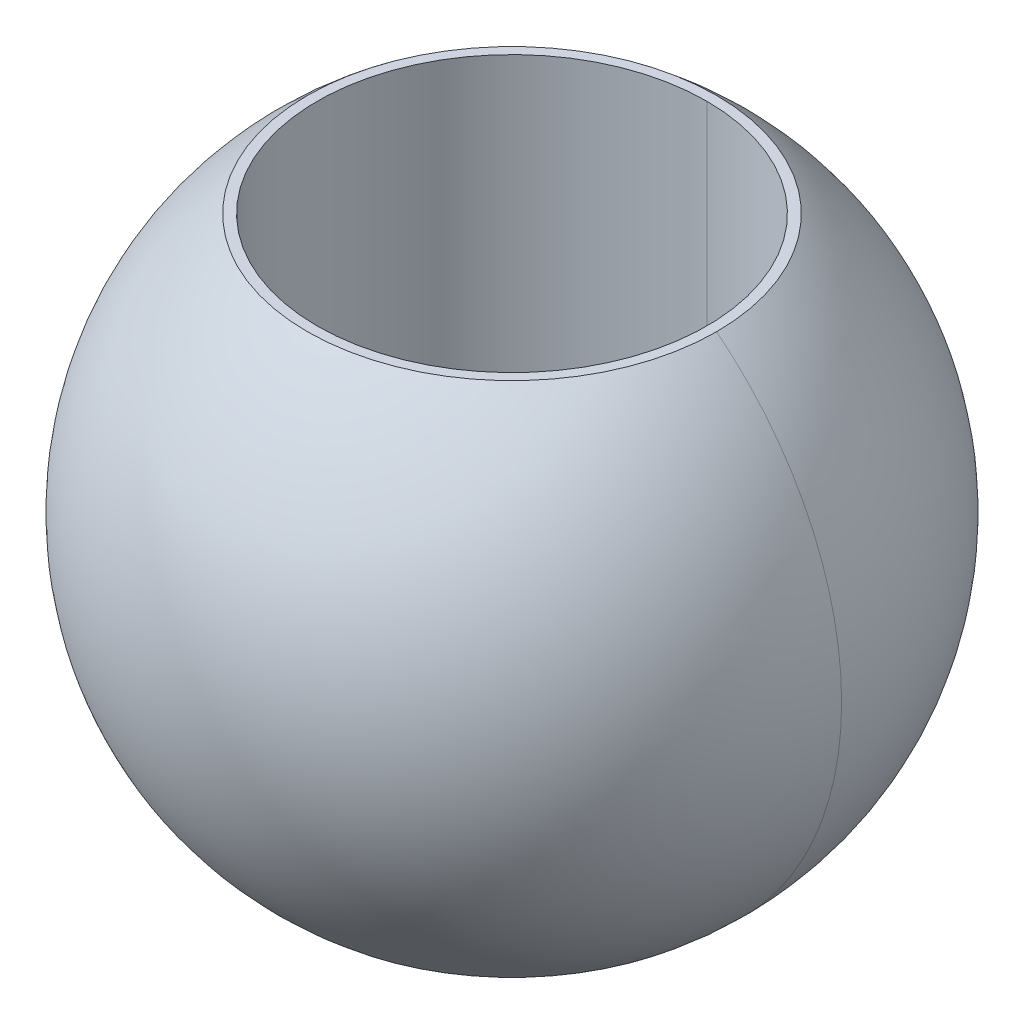
ISO-10303-21;
HEADER;
FILE_DESCRIPTION(('STEP AP214'),'2;1');
FILE_NAME('part.step','',(''),(''),'','','');
FILE_SCHEMA(('AUTOMOTIVE_DESIGN { 1 0 10303 214 1 1 1 1 }'));
ENDSEC;
DATA;
#1=APPLICATION_CONTEXT('core data for automotive mechanical design processes');
#2=APPLICATION_PROTOCOL_DEFINITION('international standard','automotive_design',2000,#1);
#3=PRODUCT_CONTEXT('',#1,'mechanical');
#4=PRODUCT('Part','Part','',(#3));
#5=PRODUCT_RELATED_PRODUCT_CATEGORY('part','',(#4));
#6=PRODUCT_DEFINITION_FORMATION('','',#4);
#7=PRODUCT_DEFINITION_CONTEXT('part definition',#1,'design');
#8=PRODUCT_DEFINITION('design','',#6,#7);
#9=PRODUCT_DEFINITION_SHAPE('','',#8);
#10=(LENGTH_UNIT() NAMED_UNIT(*) SI_UNIT(.MILLI.,.METRE.));
#11=(NAMED_UNIT(*) PLANE_ANGLE_UNIT() SI_UNIT($,.RADIAN.));
#12=(NAMED_UNIT(*) SI_UNIT($,.STERADIAN.) SOLID_ANGLE_UNIT());
#13=UNCERTAINTY_MEASURE_WITH_UNIT(LENGTH_MEASURE(1.E-05),#10,'distance_accuracy_value','');
#14=(GEOMETRIC_REPRESENTATION_CONTEXT(3) GLOBAL_UNCERTAINTY_ASSIGNED_CONTEXT((#13)) GLOBAL_UNIT_ASSIGNED_CONTEXT((#10,
#11,#12)) REPRESENTATION_CONTEXT('',''));
#15=CARTESIAN_POINT('',(0.,0.,0.));
#16=DIRECTION('',(0.,0.,1.));
#17=DIRECTION('',(1.,0.,0.));
#18=AXIS2_PLACEMENT_3D('',#15,#16,#17);
#19=CARTESIAN_POINT('',(0.,0.,0.));
#20=DIRECTION('',(0.,0.,-1.));
#21=DIRECTION('',(1.,0.,0.));
#22=AXIS2_PLACEMENT_3D('',#19,#20,#21);
#23=SPHERICAL_SURFACE('',#22,11.);
#24=CARTESIAN_POINT('',(0.,-8.62411967464942,0.));
#25=DIRECTION('',(0.,1.,0.));
#26=DIRECTION('',(0.,0.,1.));
#27=AXIS2_PLACEMENT_3D('',#24,#25,#26);
#28=CIRCLE('',#27,6.82821791079669);
#29=CARTESIAN_POINT('',(6.82821791079669,-8.62411967464942,0.));
#30=VERTEX_POINT('',#29);
#31=CARTESIAN_POINT('',(-6.82821791079669,-8.62411967464942,0.));
#32=VERTEX_POINT('',#31);
#33=EDGE_CURVE('E11',#30,#32,#28,.T.);
#34=ORIENTED_EDGE('',*,*,#33,.T.);
#35=CARTESIAN_POINT('',(0.,0.,0.));
#36=DIRECTION('',(0.,0.,-1.));
#37=DIRECTION('',(-1.,0.,0.));
#38=AXIS2_PLACEMENT_3D('',#35,#36,#37);
#39=CIRCLE('',#38,11.);
#40=CARTESIAN_POINT('',(-6.82821791079669,8.62411967464942,0.));
#41=VERTEX_POINT('',#40);
#42=EDGE_CURVE('E27',#32,#41,#39,.T.);
#43=ORIENTED_EDGE('',*,*,#42,.T.);
#44=CARTESIAN_POINT('',(0.,8.62411967464942,0.));
#45=DIRECTION('',(0.,-1.,0.));
#46=DIRECTION('',(0.,0.,-1.));
#47=AXIS2_PLACEMENT_3D('',#44,#45,#46);
#48=CIRCLE('',#47,6.82821791079669);
#49=CARTESIAN_POINT('',(6.82821791079669,8.62411967464942,0.));
#50=VERTEX_POINT('',#49);
#51=EDGE_CURVE('E87',#41,#50,#48,.T.);
#52=ORIENTED_EDGE('',*,*,#51,.T.);
#53=CARTESIAN_POINT('',(0.,0.,0.));
#54=DIRECTION('',(0.,0.,1.));
#55=DIRECTION('',(1.,0.,0.));
#56=AXIS2_PLACEMENT_3D('',#53,#54,#55);
#57=CIRCLE('',#56,11.);
#58=EDGE_CURVE('E102',#30,#50,#57,.T.);
#59=ORIENTED_EDGE('',*,*,#58,.F.);
#60=EDGE_LOOP('',(#34,#43,#52,#59));
#61=FACE_BOUND('',#60,.T.);
#62=ADVANCED_FACE('F16',(#61),#23,.T.);
#63=CARTESIAN_POINT('',(0.,-11.,0.));
#64=DIRECTION('',(0.,1.,0.));
#65=DIRECTION('',(0.,0.,1.));
#66=AXIS2_PLACEMENT_3D('',#63,#64,#65);
#67=CYLINDRICAL_SURFACE('',#66,6.5);
#68=CARTESIAN_POINT('',(0.,-8.62411967464942,0.));
#69=DIRECTION('',(0.,-1.,0.));
#70=DIRECTION('',(0.,0.,1.));
#71=AXIS2_PLACEMENT_3D('',#68,#69,#70);
#72=CIRCLE('',#71,6.5);
#73=CARTESIAN_POINT('',(0.,-8.62411967464942,6.5));
#74=VERTEX_POINT('',#73);
#75=CARTESIAN_POINT('',(0.,-8.62411967464942,-6.5));
#76=VERTEX_POINT('',#75);
#77=EDGE_CURVE('E80',#74,#76,#72,.T.);
#78=ORIENTED_EDGE('',*,*,#77,.T.);
#79=DIRECTION('',(0.,1.,0.));
#80=VECTOR('',#79,1.);
#81=CARTESIAN_POINT('',(0.,-11.,-6.5));
#82=LINE('',#81,#80);
#83=CARTESIAN_POINT('',(0.,8.62411967464942,-6.5));
#84=VERTEX_POINT('',#83);
#85=EDGE_CURVE('E71',#76,#84,#82,.T.);
#86=ORIENTED_EDGE('',*,*,#85,.T.);
#87=CARTESIAN_POINT('',(0.,8.62411967464942,0.));
#88=DIRECTION('',(0.,1.,0.));
#89=DIRECTION('',(0.,0.,-1.));
#90=AXIS2_PLACEMENT_3D('',#87,#88,#89);
#91=CIRCLE('',#90,6.5);
#92=CARTESIAN_POINT('',(0.,8.62411967464942,6.5));
#93=VERTEX_POINT('',#92);
#94=EDGE_CURVE('E81',#84,#93,#91,.T.);
#95=ORIENTED_EDGE('',*,*,#94,.T.);
#96=DIRECTION('',(0.,1.,0.));
#97=VECTOR('',#96,1.);
#98=CARTESIAN_POINT('',(0.,-11.,6.5));
#99=LINE('',#98,#97);
#100=EDGE_CURVE('E84',#74,#93,#99,.T.);
#101=ORIENTED_EDGE('',*,*,#100,.F.);
#102=EDGE_LOOP('',(#78,#86,#95,#101));
#103=FACE_BOUND('',#102,.T.);
#104=ADVANCED_FACE('F18',(#103),#67,.F.);
#105=CARTESIAN_POINT('',(0.,-11.,0.));
#106=DIRECTION('',(0.,1.,0.));
#107=DIRECTION('',(0.,0.,1.));
#108=AXIS2_PLACEMENT_3D('',#105,#106,#107);
#109=CYLINDRICAL_SURFACE('',#108,6.5);
#110=ORIENTED_EDGE('',*,*,#85,.F.);
#111=CARTESIAN_POINT('',(0.,-8.62411967464942,0.));
#112=DIRECTION('',(0.,-1.,0.));
#113=DIRECTION('',(0.,0.,1.));
#114=AXIS2_PLACEMENT_3D('',#111,#112,#113);
#115=CIRCLE('',#114,6.5);
#116=EDGE_CURVE('E75',#76,#74,#115,.T.);
#117=ORIENTED_EDGE('',*,*,#116,.T.);
#118=ORIENTED_EDGE('',*,*,#100,.T.);
#119=CARTESIAN_POINT('',(0.,8.62411967464942,0.));
#120=DIRECTION('',(0.,1.,0.));
#121=DIRECTION('',(0.,0.,-1.));
#122=AXIS2_PLACEMENT_3D('',#119,#120,#121);
#123=CIRCLE('',#122,6.5);
#124=EDGE_CURVE('E20',#93,#84,#123,.T.);
#125=ORIENTED_EDGE('',*,*,#124,.T.);
#126=EDGE_LOOP('',(#110,#117,#118,#125));
#127=FACE_BOUND('',#126,.T.);
#128=ADVANCED_FACE('F73',(#127),#109,.F.);
#129=CARTESIAN_POINT('',(-12.2006221275467,-8.62411967464942,-11.));
#130=DIRECTION('',(0.,1.,0.));
#131=DIRECTION('',(1.,0.,0.));
#132=AXIS2_PLACEMENT_3D('',#129,#130,#131);
#133=PLANE('',#132);
#134=ORIENTED_EDGE('',*,*,#33,.F.);
#135=CARTESIAN_POINT('',(0.,-8.62411967464942,0.));
#136=DIRECTION('',(0.,1.,0.));
#137=DIRECTION('',(0.,0.,1.));
#138=AXIS2_PLACEMENT_3D('',#135,#136,#137);
#139=CIRCLE('',#138,6.82821791079669);
#140=EDGE_CURVE('E105',#32,#30,#139,.T.);
#141=ORIENTED_EDGE('',*,*,#140,.F.);
#142=EDGE_LOOP('',(#134,#141));
#143=FACE_BOUND('',#142,.T.);
#144=ORIENTED_EDGE('',*,*,#77,.F.);
#145=ORIENTED_EDGE('',*,*,#116,.F.);
#146=EDGE_LOOP('',(#144,#145));
#147=FACE_BOUND('',#146,.T.);
#148=ADVANCED_FACE('F89',(#143,#147),#133,.F.);
#149=CARTESIAN_POINT('',(-11.4643776888155,8.62411967464942,-11.));
#150=DIRECTION('',(0.,-1.,0.));
#151=DIRECTION('',(0.,0.,-1.));
#152=AXIS2_PLACEMENT_3D('',#149,#150,#151);
#153=PLANE('',#152);
#154=CARTESIAN_POINT('',(0.,8.62411967464942,0.));
#155=DIRECTION('',(0.,-1.,0.));
#156=DIRECTION('',(0.,0.,-1.));
#157=AXIS2_PLACEMENT_3D('',#154,#155,#156);
#158=CIRCLE('',#157,6.82821791079669);
#159=EDGE_CURVE('E100',#50,#41,#158,.T.);
#160=ORIENTED_EDGE('',*,*,#159,.F.);
#161=ORIENTED_EDGE('',*,*,#51,.F.);
#162=EDGE_LOOP('',(#160,#161));
#163=FACE_BOUND('',#162,.T.);
#164=ORIENTED_EDGE('',*,*,#124,.F.);
#165=ORIENTED_EDGE('',*,*,#94,.F.);
#166=EDGE_LOOP('',(#164,#165));
#167=FACE_BOUND('',#166,.T.);
#168=ADVANCED_FACE('F126',(#163,#167),#153,.F.);
#169=CARTESIAN_POINT('',(0.,0.,0.));
#170=DIRECTION('',(0.,0.,-1.));
#171=DIRECTION('',(1.,0.,0.));
#172=AXIS2_PLACEMENT_3D('',#169,#170,#171);
#173=SPHERICAL_SURFACE('',#172,11.);
#174=ORIENTED_EDGE('',*,*,#42,.F.);
#175=ORIENTED_EDGE('',*,*,#140,.T.);
#176=ORIENTED_EDGE('',*,*,#58,.T.);
#177=ORIENTED_EDGE('',*,*,#159,.T.);
#178=EDGE_LOOP('',(#174,#175,#176,#177));
#179=FACE_BOUND('',#178,.T.);
#180=ADVANCED_FACE('F128',(#179),#173,.T.);
#181=CLOSED_SHELL('',(#62,#104,#128,#148,#168,#180));
#182=MANIFOLD_SOLID_BREP('B1',#181);
#183=ADVANCED_BREP_SHAPE_REPRESENTATION('',(#18,#182),#14);
#184=SHAPE_DEFINITION_REPRESENTATION(#9,#183);
ENDSEC;
END-ISO-10303-21;
